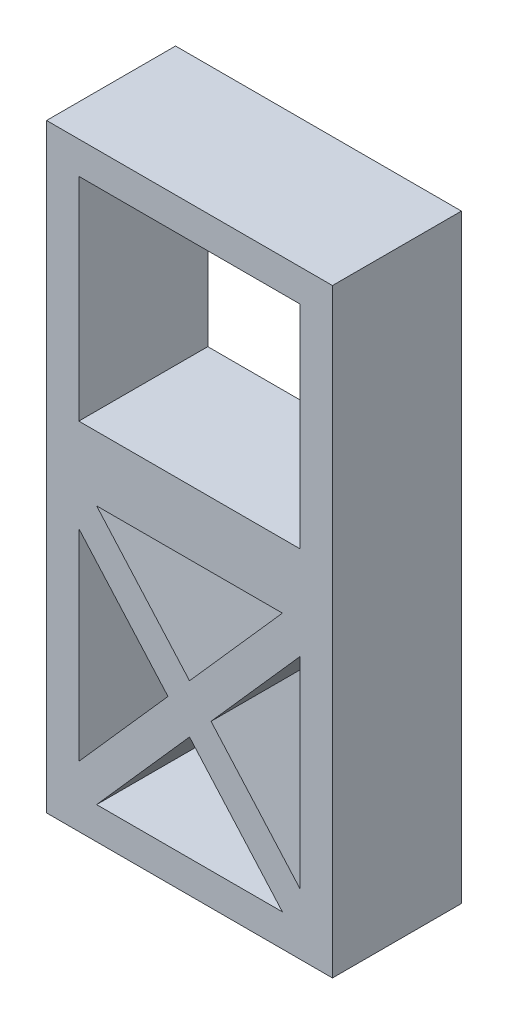
ISO-10303-21;
HEADER;
FILE_DESCRIPTION(('STEP AP214'),'2;1');
FILE_NAME('part.step','',(''),(''),'','','');
FILE_SCHEMA(('AUTOMOTIVE_DESIGN { 1 0 10303 214 1 1 1 1 }'));
ENDSEC;
DATA;
#1=APPLICATION_CONTEXT('core data for automotive mechanical design processes');
#2=APPLICATION_PROTOCOL_DEFINITION('international standard','automotive_design',2000,#1);
#3=PRODUCT_CONTEXT('',#1,'mechanical');
#4=PRODUCT('Part','Part','',(#3));
#5=PRODUCT_RELATED_PRODUCT_CATEGORY('part','',(#4));
#6=PRODUCT_DEFINITION_FORMATION('','',#4);
#7=PRODUCT_DEFINITION_CONTEXT('part definition',#1,'design');
#8=PRODUCT_DEFINITION('design','',#6,#7);
#9=PRODUCT_DEFINITION_SHAPE('','',#8);
#10=(LENGTH_UNIT() NAMED_UNIT(*) SI_UNIT(.MILLI.,.METRE.));
#11=(NAMED_UNIT(*) PLANE_ANGLE_UNIT() SI_UNIT($,.RADIAN.));
#12=(NAMED_UNIT(*) SI_UNIT($,.STERADIAN.) SOLID_ANGLE_UNIT());
#13=UNCERTAINTY_MEASURE_WITH_UNIT(LENGTH_MEASURE(1.E-05),#10,'distance_accuracy_value','');
#14=(GEOMETRIC_REPRESENTATION_CONTEXT(3) GLOBAL_UNCERTAINTY_ASSIGNED_CONTEXT((#13)) GLOBAL_UNIT_ASSIGNED_CONTEXT((#10,
#11,#12)) REPRESENTATION_CONTEXT('',''));
#15=CARTESIAN_POINT('',(0.,0.,0.));
#16=DIRECTION('',(0.,0.,1.));
#17=DIRECTION('',(1.,0.,0.));
#18=AXIS2_PLACEMENT_3D('',#15,#16,#17);
#19=CARTESIAN_POINT('',(0.,0.,25.4));
#20=DIRECTION('',(0.,0.,-1.));
#21=DIRECTION('',(-1.,0.,0.));
#22=AXIS2_PLACEMENT_3D('',#19,#20,#21);
#23=PLANE('',#22);
#24=DIRECTION('',(-0.662535793946931,0.74903025422149,0.));
#25=VECTOR('',#24,1.);
#26=CARTESIAN_POINT('',(0.,-63.8421939246647,25.4));
#27=LINE('',#26,#25);
#28=CARTESIAN_POINT('',(18.2944537397921,-84.524999987,25.4));
#29=VERTEX_POINT('',#28);
#30=CARTESIAN_POINT('',(0.,-63.8421939246647,25.4));
#31=VERTEX_POINT('',#30);
#32=EDGE_CURVE('E197',#29,#31,#27,.T.);
#33=ORIENTED_EDGE('',*,*,#32,.F.);
#34=DIRECTION('',(1.,0.,0.));
#35=VECTOR('',#34,1.);
#36=CARTESIAN_POINT('',(18.2944537397921,-84.524999987,25.4));
#37=LINE('',#36,#35);
#38=CARTESIAN_POINT('',(-18.2944537397921,-84.524999987,25.4));
#39=VERTEX_POINT('',#38);
#40=EDGE_CURVE('E203',#39,#29,#37,.T.);
#41=ORIENTED_EDGE('',*,*,#40,.F.);
#42=DIRECTION('',(-0.662535793946931,-0.74903025422149,0.));
#43=VECTOR('',#42,1.);
#44=CARTESIAN_POINT('',(0.,-63.8421939246647,25.4));
#45=LINE('',#44,#43);
#46=EDGE_CURVE('E199',#31,#39,#45,.T.);
#47=ORIENTED_EDGE('',*,*,#46,.F.);
#48=EDGE_LOOP('',(#33,#41,#47));
#49=FACE_BOUND('',#48,.T.);
#50=DIRECTION('',(0.662535793946931,0.74903025422149,0.));
#51=VECTOR('',#50,1.);
#52=CARTESIAN_POINT('',(18.2944537397921,-33.575000033,25.4));
#53=LINE('',#52,#51);
#54=CARTESIAN_POINT('',(0.,-54.2578060953353,25.4));
#55=VERTEX_POINT('',#54);
#56=CARTESIAN_POINT('',(18.2944537397921,-33.575000033,25.4));
#57=VERTEX_POINT('',#56);
#58=EDGE_CURVE('E245',#55,#57,#53,.T.);
#59=ORIENTED_EDGE('',*,*,#58,.F.);
#60=DIRECTION('',(0.662535793946931,-0.74903025422149,0.));
#61=VECTOR('',#60,1.);
#62=CARTESIAN_POINT('',(-18.2944537397921,-33.575000033,25.4));
#63=LINE('',#62,#61);
#64=CARTESIAN_POINT('',(-18.2944537397921,-33.575000033,25.4));
#65=VERTEX_POINT('',#64);
#66=EDGE_CURVE('E251',#65,#55,#63,.T.);
#67=ORIENTED_EDGE('',*,*,#66,.F.);
#68=DIRECTION('',(-1.,0.,0.));
#69=VECTOR('',#68,1.);
#70=CARTESIAN_POINT('',(-18.2944537397921,-33.575000033,25.4));
#71=LINE('',#70,#69);
#72=EDGE_CURVE('E247',#57,#65,#71,.T.);
#73=ORIENTED_EDGE('',*,*,#72,.F.);
#74=EDGE_LOOP('',(#59,#67,#73));
#75=FACE_BOUND('',#74,.T.);
#76=DIRECTION('',(0.,1.,0.));
#77=VECTOR('',#76,1.);
#78=CARTESIAN_POINT('',(28.149999961,-27.225000033,25.4));
#79=LINE('',#78,#77);
#80=CARTESIAN_POINT('',(28.149999961,-90.874999987,25.4));
#81=VERTEX_POINT('',#80);
#82=CARTESIAN_POINT('',(28.149999961,27.225000033,25.4));
#83=VERTEX_POINT('',#82);
#84=EDGE_CURVE('E300',#81,#83,#79,.T.);
#85=ORIENTED_EDGE('',*,*,#84,.T.);
#86=DIRECTION('',(-1.,0.,0.));
#87=VECTOR('',#86,1.);
#88=CARTESIAN_POINT('',(-28.149999961,27.225000033,25.4));
#89=LINE('',#88,#87);
#90=CARTESIAN_POINT('',(-28.149999961,27.225000033,25.4));
#91=VERTEX_POINT('',#90);
#92=EDGE_CURVE('E303',#83,#91,#89,.T.);
#93=ORIENTED_EDGE('',*,*,#92,.T.);
#94=DIRECTION('',(0.,-1.,0.));
#95=VECTOR('',#94,1.);
#96=CARTESIAN_POINT('',(-28.149999961,-27.225000033,25.4));
#97=LINE('',#96,#95);
#98=CARTESIAN_POINT('',(-28.149999961,-90.874999987,25.4));
#99=VERTEX_POINT('',#98);
#100=EDGE_CURVE('E306',#91,#99,#97,.T.);
#101=ORIENTED_EDGE('',*,*,#100,.T.);
#102=DIRECTION('',(1.,0.,0.));
#103=VECTOR('',#102,1.);
#104=CARTESIAN_POINT('',(-28.149999961,-90.874999987,25.4));
#105=LINE('',#104,#103);
#106=EDGE_CURVE('E308',#99,#81,#105,.T.);
#107=ORIENTED_EDGE('',*,*,#106,.T.);
#108=EDGE_LOOP('',(#85,#93,#101,#107));
#109=FACE_BOUND('',#108,.T.);
#110=DIRECTION('',(0.,1.,0.));
#111=VECTOR('',#110,1.);
#112=CARTESIAN_POINT('',(21.799999961,20.875000033,25.4));
#113=LINE('',#112,#111);
#114=CARTESIAN_POINT('',(21.799999961,-20.875000033,25.4));
#115=VERTEX_POINT('',#114);
#116=CARTESIAN_POINT('',(21.799999961,20.875000033,25.4));
#117=VERTEX_POINT('',#116);
#118=EDGE_CURVE('E269',#115,#117,#113,.T.);
#119=ORIENTED_EDGE('',*,*,#118,.F.);
#120=DIRECTION('',(1.,0.,0.));
#121=VECTOR('',#120,1.);
#122=CARTESIAN_POINT('',(-21.799999961,-20.875000033,25.4));
#123=LINE('',#122,#121);
#124=CARTESIAN_POINT('',(-21.799999961,-20.875000033,25.4));
#125=VERTEX_POINT('',#124);
#126=EDGE_CURVE('E277',#125,#115,#123,.T.);
#127=ORIENTED_EDGE('',*,*,#126,.F.);
#128=DIRECTION('',(0.,-1.,0.));
#129=VECTOR('',#128,1.);
#130=CARTESIAN_POINT('',(-21.799999961,20.875000033,25.4));
#131=LINE('',#130,#129);
#132=CARTESIAN_POINT('',(-21.799999961,20.875000033,25.4));
#133=VERTEX_POINT('',#132);
#134=EDGE_CURVE('E274',#133,#125,#131,.T.);
#135=ORIENTED_EDGE('',*,*,#134,.F.);
#136=DIRECTION('',(-1.,0.,0.));
#137=VECTOR('',#136,1.);
#138=CARTESIAN_POINT('',(-21.799999961,20.875000033,25.4));
#139=LINE('',#138,#137);
#140=EDGE_CURVE('E271',#117,#133,#139,.T.);
#141=ORIENTED_EDGE('',*,*,#140,.F.);
#142=EDGE_LOOP('',(#119,#127,#135,#141));
#143=FACE_BOUND('',#142,.T.);
#144=DIRECTION('',(0.662535793946931,-0.74903025422149,0.));
#145=VECTOR('',#144,1.);
#146=CARTESIAN_POINT('',(4.23881409610081,-59.05000001,25.4));
#147=LINE('',#146,#145);
#148=CARTESIAN_POINT('',(4.23881409610081,-59.05000001,25.4));
#149=VERTEX_POINT('',#148);
#150=CARTESIAN_POINT('',(21.7999999610001,-78.9038096199755,25.4));
#151=VERTEX_POINT('',#150);
#152=EDGE_CURVE('E221',#149,#151,#147,.T.);
#153=ORIENTED_EDGE('',*,*,#152,.F.);
#154=DIRECTION('',(-0.662535793946931,-0.74903025422149,0.));
#155=VECTOR('',#154,1.);
#156=CARTESIAN_POINT('',(21.7999999610001,-39.1961904000245,25.4));
#157=LINE('',#156,#155);
#158=CARTESIAN_POINT('',(21.7999999610001,-39.1961904000245,25.4));
#159=VERTEX_POINT('',#158);
#160=EDGE_CURVE('E227',#159,#149,#157,.T.);
#161=ORIENTED_EDGE('',*,*,#160,.F.);
#162=DIRECTION('',(0.,1.,0.));
#163=VECTOR('',#162,1.);
#164=CARTESIAN_POINT('',(21.7999999610001,-39.1961904000245,25.4));
#165=LINE('',#164,#163);
#166=EDGE_CURVE('E223',#151,#159,#165,.T.);
#167=ORIENTED_EDGE('',*,*,#166,.F.);
#168=EDGE_LOOP('',(#153,#161,#167));
#169=FACE_BOUND('',#168,.T.);
#170=DIRECTION('',(-0.662535793946931,0.74903025422149,0.));
#171=VECTOR('',#170,1.);
#172=CARTESIAN_POINT('',(-21.799999961,-39.1961904000245,25.4));
#173=LINE('',#172,#171);
#174=CARTESIAN_POINT('',(-4.23881409610075,-59.05000001,25.4));
#175=VERTEX_POINT('',#174);
#176=CARTESIAN_POINT('',(-21.799999961,-39.1961904000245,25.4));
#177=VERTEX_POINT('',#176);
#178=EDGE_CURVE('E170',#175,#177,#173,.T.);
#179=ORIENTED_EDGE('',*,*,#178,.F.);
#180=DIRECTION('',(0.662535793946931,0.74903025422149,0.));
#181=VECTOR('',#180,1.);
#182=CARTESIAN_POINT('',(-4.23881409610075,-59.05000001,25.4));
#183=LINE('',#182,#181);
#184=CARTESIAN_POINT('',(-21.799999961,-78.9038096199755,25.4));
#185=VERTEX_POINT('',#184);
#186=EDGE_CURVE('E187',#185,#175,#183,.T.);
#187=ORIENTED_EDGE('',*,*,#186,.F.);
#188=DIRECTION('',(0.,-1.,0.));
#189=VECTOR('',#188,1.);
#190=CARTESIAN_POINT('',(-21.799999961,-78.9038096199755,25.4));
#191=LINE('',#190,#189);
#192=EDGE_CURVE('E178',#177,#185,#191,.T.);
#193=ORIENTED_EDGE('',*,*,#192,.F.);
#194=EDGE_LOOP('',(#179,#187,#193));
#195=FACE_BOUND('',#194,.T.);
#196=ADVANCED_FACE('F33',(#49,#75,#109,#143,#169,#195),#23,.F.);
#197=CARTESIAN_POINT('',(0.,0.,0.));
#198=DIRECTION('',(0.,0.,-1.));
#199=DIRECTION('',(-1.,0.,0.));
#200=AXIS2_PLACEMENT_3D('',#197,#198,#199);
#201=PLANE('',#200);
#202=DIRECTION('',(-1.,0.,0.));
#203=VECTOR('',#202,1.);
#204=CARTESIAN_POINT('',(-28.149999961,27.225000033,0.));
#205=LINE('',#204,#203);
#206=CARTESIAN_POINT('',(28.149999961,27.225000033,0.));
#207=VERTEX_POINT('',#206);
#208=CARTESIAN_POINT('',(-28.149999961,27.225000033,0.));
#209=VERTEX_POINT('',#208);
#210=EDGE_CURVE('E299',#207,#209,#205,.T.);
#211=ORIENTED_EDGE('',*,*,#210,.F.);
#212=DIRECTION('',(0.,1.,0.));
#213=VECTOR('',#212,1.);
#214=CARTESIAN_POINT('',(28.149999961,-27.225000033,0.));
#215=LINE('',#214,#213);
#216=CARTESIAN_POINT('',(28.149999961,-90.874999987,0.));
#217=VERTEX_POINT('',#216);
#218=EDGE_CURVE('E304',#217,#207,#215,.T.);
#219=ORIENTED_EDGE('',*,*,#218,.F.);
#220=DIRECTION('',(1.,0.,0.));
#221=VECTOR('',#220,1.);
#222=CARTESIAN_POINT('',(-28.149999961,-90.874999987,0.));
#223=LINE('',#222,#221);
#224=CARTESIAN_POINT('',(-28.149999961,-90.874999987,0.));
#225=VERTEX_POINT('',#224);
#226=EDGE_CURVE('E316',#225,#217,#223,.T.);
#227=ORIENTED_EDGE('',*,*,#226,.F.);
#228=DIRECTION('',(0.,-1.,0.));
#229=VECTOR('',#228,1.);
#230=CARTESIAN_POINT('',(-28.149999961,-27.225000033,0.));
#231=LINE('',#230,#229);
#232=EDGE_CURVE('E314',#209,#225,#231,.T.);
#233=ORIENTED_EDGE('',*,*,#232,.F.);
#234=EDGE_LOOP('',(#211,#219,#227,#233));
#235=FACE_BOUND('',#234,.T.);
#236=DIRECTION('',(1.,0.,0.));
#237=VECTOR('',#236,1.);
#238=CARTESIAN_POINT('',(-21.799999961,-20.875000033,0.));
#239=LINE('',#238,#237);
#240=CARTESIAN_POINT('',(-21.799999961,-20.875000033,0.));
#241=VERTEX_POINT('',#240);
#242=CARTESIAN_POINT('',(21.799999961,-20.875000033,0.));
#243=VERTEX_POINT('',#242);
#244=EDGE_CURVE('E272',#241,#243,#239,.T.);
#245=ORIENTED_EDGE('',*,*,#244,.T.);
#246=DIRECTION('',(0.,1.,0.));
#247=VECTOR('',#246,1.);
#248=CARTESIAN_POINT('',(21.799999961,20.875000033,0.));
#249=LINE('',#248,#247);
#250=CARTESIAN_POINT('',(21.799999961,20.875000033,0.));
#251=VERTEX_POINT('',#250);
#252=EDGE_CURVE('E268',#243,#251,#249,.T.);
#253=ORIENTED_EDGE('',*,*,#252,.T.);
#254=DIRECTION('',(-1.,0.,0.));
#255=VECTOR('',#254,1.);
#256=CARTESIAN_POINT('',(-21.799999961,20.875000033,0.));
#257=LINE('',#256,#255);
#258=CARTESIAN_POINT('',(-21.799999961,20.875000033,0.));
#259=VERTEX_POINT('',#258);
#260=EDGE_CURVE('E282',#251,#259,#257,.T.);
#261=ORIENTED_EDGE('',*,*,#260,.T.);
#262=DIRECTION('',(0.,-1.,0.));
#263=VECTOR('',#262,1.);
#264=CARTESIAN_POINT('',(-21.799999961,20.875000033,0.));
#265=LINE('',#264,#263);
#266=EDGE_CURVE('E285',#259,#241,#265,.T.);
#267=ORIENTED_EDGE('',*,*,#266,.T.);
#268=EDGE_LOOP('',(#245,#253,#261,#267));
#269=FACE_BOUND('',#268,.T.);
#270=DIRECTION('',(0.662535793946931,-0.74903025422149,0.));
#271=VECTOR('',#270,1.);
#272=CARTESIAN_POINT('',(-18.2944537397921,-33.575000033,0.));
#273=LINE('',#272,#271);
#274=CARTESIAN_POINT('',(-18.2944537397921,-33.575000033,0.));
#275=VERTEX_POINT('',#274);
#276=CARTESIAN_POINT('',(0.,-54.2578060953353,0.));
#277=VERTEX_POINT('',#276);
#278=EDGE_CURVE('E248',#275,#277,#273,.T.);
#279=ORIENTED_EDGE('',*,*,#278,.T.);
#280=DIRECTION('',(0.662535793946931,0.74903025422149,0.));
#281=VECTOR('',#280,1.);
#282=CARTESIAN_POINT('',(18.2944537397921,-33.575000033,0.));
#283=LINE('',#282,#281);
#284=CARTESIAN_POINT('',(18.2944537397921,-33.575000033,0.));
#285=VERTEX_POINT('',#284);
#286=EDGE_CURVE('E244',#277,#285,#283,.T.);
#287=ORIENTED_EDGE('',*,*,#286,.T.);
#288=DIRECTION('',(-1.,0.,0.));
#289=VECTOR('',#288,1.);
#290=CARTESIAN_POINT('',(-18.2944537397921,-33.575000033,0.));
#291=LINE('',#290,#289);
#292=EDGE_CURVE('E256',#285,#275,#291,.T.);
#293=ORIENTED_EDGE('',*,*,#292,.T.);
#294=EDGE_LOOP('',(#279,#287,#293));
#295=FACE_BOUND('',#294,.T.);
#296=DIRECTION('',(-0.662535793946931,-0.74903025422149,0.));
#297=VECTOR('',#296,1.);
#298=CARTESIAN_POINT('',(21.7999999610001,-39.1961904000245,0.));
#299=LINE('',#298,#297);
#300=CARTESIAN_POINT('',(21.7999999610001,-39.1961904000245,0.));
#301=VERTEX_POINT('',#300);
#302=CARTESIAN_POINT('',(4.2388140961008,-59.05000001,0.));
#303=VERTEX_POINT('',#302);
#304=EDGE_CURVE('E224',#301,#303,#299,.T.);
#305=ORIENTED_EDGE('',*,*,#304,.T.);
#306=DIRECTION('',(0.662535793946931,-0.74903025422149,0.));
#307=VECTOR('',#306,1.);
#308=CARTESIAN_POINT('',(4.23881409610081,-59.05000001,0.));
#309=LINE('',#308,#307);
#310=CARTESIAN_POINT('',(21.7999999610001,-78.9038096199755,0.));
#311=VERTEX_POINT('',#310);
#312=EDGE_CURVE('E220',#303,#311,#309,.T.);
#313=ORIENTED_EDGE('',*,*,#312,.T.);
#314=DIRECTION('',(0.,1.,0.));
#315=VECTOR('',#314,1.);
#316=CARTESIAN_POINT('',(21.7999999610001,-39.1961904000245,0.));
#317=LINE('',#316,#315);
#318=EDGE_CURVE('E232',#311,#301,#317,.T.);
#319=ORIENTED_EDGE('',*,*,#318,.T.);
#320=EDGE_LOOP('',(#305,#313,#319));
#321=FACE_BOUND('',#320,.T.);
#322=DIRECTION('',(1.,0.,0.));
#323=VECTOR('',#322,1.);
#324=CARTESIAN_POINT('',(18.2944537397921,-84.524999987,0.));
#325=LINE('',#324,#323);
#326=CARTESIAN_POINT('',(-18.2944537397921,-84.524999987,0.));
#327=VERTEX_POINT('',#326);
#328=CARTESIAN_POINT('',(18.2944537397921,-84.524999987,0.));
#329=VERTEX_POINT('',#328);
#330=EDGE_CURVE('E200',#327,#329,#325,.T.);
#331=ORIENTED_EDGE('',*,*,#330,.T.);
#332=DIRECTION('',(-0.662535793946931,0.74903025422149,0.));
#333=VECTOR('',#332,1.);
#334=CARTESIAN_POINT('',(0.,-63.8421939246647,0.));
#335=LINE('',#334,#333);
#336=CARTESIAN_POINT('',(0.,-63.8421939246647,0.));
#337=VERTEX_POINT('',#336);
#338=EDGE_CURVE('E185',#329,#337,#335,.T.);
#339=ORIENTED_EDGE('',*,*,#338,.T.);
#340=DIRECTION('',(-0.662535793946931,-0.74903025422149,0.));
#341=VECTOR('',#340,1.);
#342=CARTESIAN_POINT('',(0.,-63.8421939246647,0.));
#343=LINE('',#342,#341);
#344=EDGE_CURVE('E208',#337,#327,#343,.T.);
#345=ORIENTED_EDGE('',*,*,#344,.T.);
#346=EDGE_LOOP('',(#331,#339,#345));
#347=FACE_BOUND('',#346,.T.);
#348=DIRECTION('',(0.662535793946931,0.74903025422149,0.));
#349=VECTOR('',#348,1.);
#350=CARTESIAN_POINT('',(-4.23881409610075,-59.05000001,0.));
#351=LINE('',#350,#349);
#352=CARTESIAN_POINT('',(-21.799999961,-78.9038096199755,0.));
#353=VERTEX_POINT('',#352);
#354=CARTESIAN_POINT('',(-4.23881409610074,-59.05000001,0.));
#355=VERTEX_POINT('',#354);
#356=EDGE_CURVE('E179',#353,#355,#351,.T.);
#357=ORIENTED_EDGE('',*,*,#356,.T.);
#358=DIRECTION('',(-0.662535793946931,0.74903025422149,0.));
#359=VECTOR('',#358,1.);
#360=CARTESIAN_POINT('',(-21.799999961,-39.1961904000245,0.));
#361=LINE('',#360,#359);
#362=CARTESIAN_POINT('',(-21.799999961,-39.1961904000245,0.));
#363=VERTEX_POINT('',#362);
#364=EDGE_CURVE('E56',#355,#363,#361,.T.);
#365=ORIENTED_EDGE('',*,*,#364,.T.);
#366=DIRECTION('',(0.,-1.,0.));
#367=VECTOR('',#366,1.);
#368=CARTESIAN_POINT('',(-21.799999961,-78.9038096199755,0.));
#369=LINE('',#368,#367);
#370=EDGE_CURVE('E184',#363,#353,#369,.T.);
#371=ORIENTED_EDGE('',*,*,#370,.T.);
#372=EDGE_LOOP('',(#357,#365,#371));
#373=FACE_BOUND('',#372,.T.);
#374=ADVANCED_FACE('F334',(#235,#269,#295,#321,#347,#373),#201,.T.);
#375=CARTESIAN_POINT('',(-28.149999961,27.225000033,25.4));
#376=DIRECTION('',(0.,-1.,0.));
#377=DIRECTION('',(0.,0.,-1.));
#378=AXIS2_PLACEMENT_3D('',#375,#376,#377);
#379=PLANE('',#378);
#380=ORIENTED_EDGE('',*,*,#210,.T.);
#381=DIRECTION('',(0.,0.,-1.));
#382=VECTOR('',#381,1.);
#383=CARTESIAN_POINT('',(-28.149999961,27.225000033,25.4));
#384=LINE('',#383,#382);
#385=EDGE_CURVE('E41',#91,#209,#384,.T.);
#386=ORIENTED_EDGE('',*,*,#385,.F.);
#387=ORIENTED_EDGE('',*,*,#92,.F.);
#388=DIRECTION('',(0.,0.,-1.));
#389=VECTOR('',#388,1.);
#390=CARTESIAN_POINT('',(28.149999961,27.225000033,25.4));
#391=LINE('',#390,#389);
#392=EDGE_CURVE('E11',#83,#207,#391,.T.);
#393=ORIENTED_EDGE('',*,*,#392,.T.);
#394=EDGE_LOOP('',(#380,#386,#387,#393));
#395=FACE_BOUND('',#394,.T.);
#396=ADVANCED_FACE('F35',(#395),#379,.F.);
#397=CARTESIAN_POINT('',(-28.149999961,-27.225000033,25.4));
#398=DIRECTION('',(1.,0.,0.));
#399=DIRECTION('',(0.,1.,0.));
#400=AXIS2_PLACEMENT_3D('',#397,#398,#399);
#401=PLANE('',#400);
#402=ORIENTED_EDGE('',*,*,#232,.T.);
#403=DIRECTION('',(0.,0.,-1.));
#404=VECTOR('',#403,1.);
#405=CARTESIAN_POINT('',(-28.149999961,-90.874999987,25.4));
#406=LINE('',#405,#404);
#407=EDGE_CURVE('E321',#99,#225,#406,.T.);
#408=ORIENTED_EDGE('',*,*,#407,.F.);
#409=ORIENTED_EDGE('',*,*,#100,.F.);
#410=ORIENTED_EDGE('',*,*,#385,.T.);
#411=EDGE_LOOP('',(#402,#408,#409,#410));
#412=FACE_BOUND('',#411,.T.);
#413=ADVANCED_FACE('F327',(#412),#401,.F.);
#414=CARTESIAN_POINT('',(-28.149999961,-90.874999987,25.4));
#415=DIRECTION('',(0.,1.,0.));
#416=DIRECTION('',(0.,0.,1.));
#417=AXIS2_PLACEMENT_3D('',#414,#415,#416);
#418=PLANE('',#417);
#419=ORIENTED_EDGE('',*,*,#226,.T.);
#420=DIRECTION('',(0.,0.,-1.));
#421=VECTOR('',#420,1.);
#422=CARTESIAN_POINT('',(28.149999961,-90.874999987,25.4));
#423=LINE('',#422,#421);
#424=EDGE_CURVE('E311',#81,#217,#423,.T.);
#425=ORIENTED_EDGE('',*,*,#424,.F.);
#426=ORIENTED_EDGE('',*,*,#106,.F.);
#427=ORIENTED_EDGE('',*,*,#407,.T.);
#428=EDGE_LOOP('',(#419,#425,#426,#427));
#429=FACE_BOUND('',#428,.T.);
#430=ADVANCED_FACE('F339',(#429),#418,.F.);
#431=CARTESIAN_POINT('',(28.149999961,-27.225000033,25.4));
#432=DIRECTION('',(-1.,0.,0.));
#433=DIRECTION('',(0.,-1.,0.));
#434=AXIS2_PLACEMENT_3D('',#431,#432,#433);
#435=PLANE('',#434);
#436=ORIENTED_EDGE('',*,*,#218,.T.);
#437=ORIENTED_EDGE('',*,*,#392,.F.);
#438=ORIENTED_EDGE('',*,*,#84,.F.);
#439=ORIENTED_EDGE('',*,*,#424,.T.);
#440=EDGE_LOOP('',(#436,#437,#438,#439));
#441=FACE_BOUND('',#440,.T.);
#442=ADVANCED_FACE('F342',(#441),#435,.F.);
#443=CARTESIAN_POINT('',(21.799999961,20.875000033,25.4));
#444=DIRECTION('',(-1.,0.,0.));
#445=DIRECTION('',(0.,-1.,0.));
#446=AXIS2_PLACEMENT_3D('',#443,#444,#445);
#447=PLANE('',#446);
#448=ORIENTED_EDGE('',*,*,#252,.F.);
#449=DIRECTION('',(0.,0.,-1.));
#450=VECTOR('',#449,1.);
#451=CARTESIAN_POINT('',(21.799999961,-20.875000033,25.4));
#452=LINE('',#451,#450);
#453=EDGE_CURVE('E279',#115,#243,#452,.T.);
#454=ORIENTED_EDGE('',*,*,#453,.F.);
#455=ORIENTED_EDGE('',*,*,#118,.T.);
#456=DIRECTION('',(0.,0.,-1.));
#457=VECTOR('',#456,1.);
#458=CARTESIAN_POINT('',(21.799999961,20.875000033,25.4));
#459=LINE('',#458,#457);
#460=EDGE_CURVE('E296',#117,#251,#459,.T.);
#461=ORIENTED_EDGE('',*,*,#460,.T.);
#462=EDGE_LOOP('',(#448,#454,#455,#461));
#463=FACE_BOUND('',#462,.T.);
#464=ADVANCED_FACE('F404',(#463),#447,.T.);
#465=CARTESIAN_POINT('',(-21.799999961,20.875000033,25.4));
#466=DIRECTION('',(0.,-1.,0.));
#467=DIRECTION('',(0.,0.,-1.));
#468=AXIS2_PLACEMENT_3D('',#465,#466,#467);
#469=PLANE('',#468);
#470=ORIENTED_EDGE('',*,*,#260,.F.);
#471=ORIENTED_EDGE('',*,*,#460,.F.);
#472=ORIENTED_EDGE('',*,*,#140,.T.);
#473=DIRECTION('',(0.,0.,-1.));
#474=VECTOR('',#473,1.);
#475=CARTESIAN_POINT('',(-21.799999961,20.875000033,25.4));
#476=LINE('',#475,#474);
#477=EDGE_CURVE('E294',#133,#259,#476,.T.);
#478=ORIENTED_EDGE('',*,*,#477,.T.);
#479=EDGE_LOOP('',(#470,#471,#472,#478));
#480=FACE_BOUND('',#479,.T.);
#481=ADVANCED_FACE('F400',(#480),#469,.T.);
#482=CARTESIAN_POINT('',(-21.799999961,20.875000033,25.4));
#483=DIRECTION('',(1.,0.,0.));
#484=DIRECTION('',(0.,1.,0.));
#485=AXIS2_PLACEMENT_3D('',#482,#483,#484);
#486=PLANE('',#485);
#487=ORIENTED_EDGE('',*,*,#266,.F.);
#488=ORIENTED_EDGE('',*,*,#477,.F.);
#489=ORIENTED_EDGE('',*,*,#134,.T.);
#490=DIRECTION('',(0.,0.,-1.));
#491=VECTOR('',#490,1.);
#492=CARTESIAN_POINT('',(-21.799999961,-20.875000033,25.4));
#493=LINE('',#492,#491);
#494=EDGE_CURVE('E292',#125,#241,#493,.T.);
#495=ORIENTED_EDGE('',*,*,#494,.T.);
#496=EDGE_LOOP('',(#487,#488,#489,#495));
#497=FACE_BOUND('',#496,.T.);
#498=ADVANCED_FACE('F396',(#497),#486,.T.);
#499=CARTESIAN_POINT('',(-21.799999961,-20.875000033,25.4));
#500=DIRECTION('',(0.,1.,0.));
#501=DIRECTION('',(0.,0.,1.));
#502=AXIS2_PLACEMENT_3D('',#499,#500,#501);
#503=PLANE('',#502);
#504=ORIENTED_EDGE('',*,*,#244,.F.);
#505=ORIENTED_EDGE('',*,*,#494,.F.);
#506=ORIENTED_EDGE('',*,*,#126,.T.);
#507=ORIENTED_EDGE('',*,*,#453,.T.);
#508=EDGE_LOOP('',(#504,#505,#506,#507));
#509=FACE_BOUND('',#508,.T.);
#510=ADVANCED_FACE('F392',(#509),#503,.T.);
#511=CARTESIAN_POINT('',(18.2944537397921,-33.575000033,25.4));
#512=DIRECTION('',(-0.74903025422149,0.662535793946931,0.));
#513=DIRECTION('',(-0.662535793946931,-0.74903025422149,0.));
#514=AXIS2_PLACEMENT_3D('',#511,#512,#513);
#515=PLANE('',#514);
#516=ORIENTED_EDGE('',*,*,#286,.F.);
#517=DIRECTION('',(0.,0.,-1.));
#518=VECTOR('',#517,1.);
#519=CARTESIAN_POINT('',(0.,-54.2578060953353,25.4));
#520=LINE('',#519,#518);
#521=EDGE_CURVE('E253',#55,#277,#520,.T.);
#522=ORIENTED_EDGE('',*,*,#521,.F.);
#523=ORIENTED_EDGE('',*,*,#58,.T.);
#524=DIRECTION('',(0.,0.,-1.));
#525=VECTOR('',#524,1.);
#526=CARTESIAN_POINT('',(18.2944537397921,-33.575000033,25.4));
#527=LINE('',#526,#525);
#528=EDGE_CURVE('E265',#57,#285,#527,.T.);
#529=ORIENTED_EDGE('',*,*,#528,.T.);
#530=EDGE_LOOP('',(#516,#522,#523,#529));
#531=FACE_BOUND('',#530,.T.);
#532=ADVANCED_FACE('F388',(#531),#515,.T.);
#533=CARTESIAN_POINT('',(-18.2944537397921,-33.575000033,25.4));
#534=DIRECTION('',(0.,-1.,0.));
#535=DIRECTION('',(1.,0.,0.));
#536=AXIS2_PLACEMENT_3D('',#533,#534,#535);
#537=PLANE('',#536);
#538=ORIENTED_EDGE('',*,*,#292,.F.);
#539=ORIENTED_EDGE('',*,*,#528,.F.);
#540=ORIENTED_EDGE('',*,*,#72,.T.);
#541=DIRECTION('',(0.,0.,-1.));
#542=VECTOR('',#541,1.);
#543=CARTESIAN_POINT('',(-18.2944537397921,-33.575000033,25.4));
#544=LINE('',#543,#542);
#545=EDGE_CURVE('E263',#65,#275,#544,.T.);
#546=ORIENTED_EDGE('',*,*,#545,.T.);
#547=EDGE_LOOP('',(#538,#539,#540,#546));
#548=FACE_BOUND('',#547,.T.);
#549=ADVANCED_FACE('F384',(#548),#537,.T.);
#550=CARTESIAN_POINT('',(-18.2944537397921,-33.575000033,25.4));
#551=DIRECTION('',(0.74903025422149,0.662535793946931,0.));
#552=DIRECTION('',(-0.662535793946931,0.74903025422149,0.));
#553=AXIS2_PLACEMENT_3D('',#550,#551,#552);
#554=PLANE('',#553);
#555=ORIENTED_EDGE('',*,*,#278,.F.);
#556=ORIENTED_EDGE('',*,*,#545,.F.);
#557=ORIENTED_EDGE('',*,*,#66,.T.);
#558=ORIENTED_EDGE('',*,*,#521,.T.);
#559=EDGE_LOOP('',(#555,#556,#557,#558));
#560=FACE_BOUND('',#559,.T.);
#561=ADVANCED_FACE('F381',(#560),#554,.T.);
#562=CARTESIAN_POINT('',(4.23881409610081,-59.05000001,25.4));
#563=DIRECTION('',(0.74903025422149,0.662535793946931,0.));
#564=DIRECTION('',(-0.662535793946931,0.74903025422149,0.));
#565=AXIS2_PLACEMENT_3D('',#562,#563,#564);
#566=PLANE('',#565);
#567=ORIENTED_EDGE('',*,*,#312,.F.);
#568=DIRECTION('',(0.,0.,-1.));
#569=VECTOR('',#568,1.);
#570=CARTESIAN_POINT('',(4.23881409610081,-59.05000001,25.4));
#571=LINE('',#570,#569);
#572=EDGE_CURVE('E229',#149,#303,#571,.T.);
#573=ORIENTED_EDGE('',*,*,#572,.F.);
#574=ORIENTED_EDGE('',*,*,#152,.T.);
#575=DIRECTION('',(0.,0.,-1.));
#576=VECTOR('',#575,1.);
#577=CARTESIAN_POINT('',(21.7999999610001,-78.9038096199755,25.4));
#578=LINE('',#577,#576);
#579=EDGE_CURVE('E241',#151,#311,#578,.T.);
#580=ORIENTED_EDGE('',*,*,#579,.T.);
#581=EDGE_LOOP('',(#567,#573,#574,#580));
#582=FACE_BOUND('',#581,.T.);
#583=ADVANCED_FACE('F358',(#582),#566,.T.);
#584=CARTESIAN_POINT('',(21.7999999610001,-39.1961904000245,25.4));
#585=DIRECTION('',(-1.,0.,0.));
#586=DIRECTION('',(0.,0.,1.));
#587=AXIS2_PLACEMENT_3D('',#584,#585,#586);
#588=PLANE('',#587);
#589=ORIENTED_EDGE('',*,*,#318,.F.);
#590=ORIENTED_EDGE('',*,*,#579,.F.);
#591=ORIENTED_EDGE('',*,*,#166,.T.);
#592=DIRECTION('',(0.,0.,-1.));
#593=VECTOR('',#592,1.);
#594=CARTESIAN_POINT('',(21.7999999610001,-39.1961904000245,25.4));
#595=LINE('',#594,#593);
#596=EDGE_CURVE('E239',#159,#301,#595,.T.);
#597=ORIENTED_EDGE('',*,*,#596,.T.);
#598=EDGE_LOOP('',(#589,#590,#591,#597));
#599=FACE_BOUND('',#598,.T.);
#600=ADVANCED_FACE('F360',(#599),#588,.T.);
#601=CARTESIAN_POINT('',(21.7999999610001,-39.1961904000245,25.4));
#602=DIRECTION('',(0.74903025422149,-0.662535793946931,0.));
#603=DIRECTION('',(0.662535793946931,0.74903025422149,0.));
#604=AXIS2_PLACEMENT_3D('',#601,#602,#603);
#605=PLANE('',#604);
#606=ORIENTED_EDGE('',*,*,#304,.F.);
#607=ORIENTED_EDGE('',*,*,#596,.F.);
#608=ORIENTED_EDGE('',*,*,#160,.T.);
#609=ORIENTED_EDGE('',*,*,#572,.T.);
#610=EDGE_LOOP('',(#606,#607,#608,#609));
#611=FACE_BOUND('',#610,.T.);
#612=ADVANCED_FACE('F365',(#611),#605,.T.);
#613=CARTESIAN_POINT('',(0.,-63.8421939246647,25.4));
#614=DIRECTION('',(-0.74903025422149,-0.662535793946931,0.));
#615=DIRECTION('',(0.662535793946931,-0.74903025422149,0.));
#616=AXIS2_PLACEMENT_3D('',#613,#614,#615);
#617=PLANE('',#616);
#618=ORIENTED_EDGE('',*,*,#338,.F.);
#619=DIRECTION('',(0.,0.,-1.));
#620=VECTOR('',#619,1.);
#621=CARTESIAN_POINT('',(18.2944537397921,-84.524999987,25.4));
#622=LINE('',#621,#620);
#623=EDGE_CURVE('E205',#29,#329,#622,.T.);
#624=ORIENTED_EDGE('',*,*,#623,.F.);
#625=ORIENTED_EDGE('',*,*,#32,.T.);
#626=DIRECTION('',(0.,0.,-1.));
#627=VECTOR('',#626,1.);
#628=CARTESIAN_POINT('',(0.,-63.8421939246647,25.4));
#629=LINE('',#628,#627);
#630=EDGE_CURVE('E217',#31,#337,#629,.T.);
#631=ORIENTED_EDGE('',*,*,#630,.T.);
#632=EDGE_LOOP('',(#618,#624,#625,#631));
#633=FACE_BOUND('',#632,.T.);
#634=ADVANCED_FACE('F367',(#633),#617,.T.);
#635=CARTESIAN_POINT('',(0.,-63.8421939246647,25.4));
#636=DIRECTION('',(0.74903025422149,-0.662535793946931,0.));
#637=DIRECTION('',(0.662535793946931,0.74903025422149,0.));
#638=AXIS2_PLACEMENT_3D('',#635,#636,#637);
#639=PLANE('',#638);
#640=ORIENTED_EDGE('',*,*,#344,.F.);
#641=ORIENTED_EDGE('',*,*,#630,.F.);
#642=ORIENTED_EDGE('',*,*,#46,.T.);
#643=DIRECTION('',(0.,0.,-1.));
#644=VECTOR('',#643,1.);
#645=CARTESIAN_POINT('',(-18.2944537397921,-84.524999987,25.4));
#646=LINE('',#645,#644);
#647=EDGE_CURVE('E215',#39,#327,#646,.T.);
#648=ORIENTED_EDGE('',*,*,#647,.T.);
#649=EDGE_LOOP('',(#640,#641,#642,#648));
#650=FACE_BOUND('',#649,.T.);
#651=ADVANCED_FACE('F373',(#650),#639,.T.);
#652=CARTESIAN_POINT('',(18.2944537397921,-84.524999987,25.4));
#653=DIRECTION('',(0.,1.,0.));
#654=DIRECTION('',(-1.,0.,0.));
#655=AXIS2_PLACEMENT_3D('',#652,#653,#654);
#656=PLANE('',#655);
#657=ORIENTED_EDGE('',*,*,#330,.F.);
#658=ORIENTED_EDGE('',*,*,#647,.F.);
#659=ORIENTED_EDGE('',*,*,#40,.T.);
#660=ORIENTED_EDGE('',*,*,#623,.T.);
#661=EDGE_LOOP('',(#657,#658,#659,#660));
#662=FACE_BOUND('',#661,.T.);
#663=ADVANCED_FACE('F516',(#662),#656,.T.);
#664=CARTESIAN_POINT('',(-21.799999961,-39.1961904000245,25.4));
#665=DIRECTION('',(-0.74903025422149,-0.662535793946931,0.));
#666=DIRECTION('',(0.662535793946931,-0.74903025422149,0.));
#667=AXIS2_PLACEMENT_3D('',#664,#665,#666);
#668=PLANE('',#667);
#669=ORIENTED_EDGE('',*,*,#364,.F.);
#670=DIRECTION('',(0.,0.,-1.));
#671=VECTOR('',#670,1.);
#672=CARTESIAN_POINT('',(-4.23881409610075,-59.05000001,25.4));
#673=LINE('',#672,#671);
#674=EDGE_CURVE('E174',#175,#355,#673,.T.);
#675=ORIENTED_EDGE('',*,*,#674,.F.);
#676=ORIENTED_EDGE('',*,*,#178,.T.);
#677=DIRECTION('',(0.,0.,-1.));
#678=VECTOR('',#677,1.);
#679=CARTESIAN_POINT('',(-21.799999961,-39.1961904000245,25.4));
#680=LINE('',#679,#678);
#681=EDGE_CURVE('E173',#177,#363,#680,.T.);
#682=ORIENTED_EDGE('',*,*,#681,.T.);
#683=EDGE_LOOP('',(#669,#675,#676,#682));
#684=FACE_BOUND('',#683,.T.);
#685=ADVANCED_FACE('F172',(#684),#668,.T.);
#686=CARTESIAN_POINT('',(-21.799999961,-78.9038096199755,25.4));
#687=DIRECTION('',(1.,0.,0.));
#688=DIRECTION('',(0.,0.,-1.));
#689=AXIS2_PLACEMENT_3D('',#686,#687,#688);
#690=PLANE('',#689);
#691=ORIENTED_EDGE('',*,*,#370,.F.);
#692=ORIENTED_EDGE('',*,*,#681,.F.);
#693=ORIENTED_EDGE('',*,*,#192,.T.);
#694=DIRECTION('',(0.,0.,-1.));
#695=VECTOR('',#694,1.);
#696=CARTESIAN_POINT('',(-21.799999961,-78.9038096199755,25.4));
#697=LINE('',#696,#695);
#698=EDGE_CURVE('E48',#185,#353,#697,.T.);
#699=ORIENTED_EDGE('',*,*,#698,.T.);
#700=EDGE_LOOP('',(#691,#692,#693,#699));
#701=FACE_BOUND('',#700,.T.);
#702=ADVANCED_FACE('F182',(#701),#690,.T.);
#703=CARTESIAN_POINT('',(-4.23881409610075,-59.05000001,25.4));
#704=DIRECTION('',(-0.74903025422149,0.662535793946931,0.));
#705=DIRECTION('',(-0.662535793946931,-0.74903025422149,0.));
#706=AXIS2_PLACEMENT_3D('',#703,#704,#705);
#707=PLANE('',#706);
#708=ORIENTED_EDGE('',*,*,#356,.F.);
#709=ORIENTED_EDGE('',*,*,#698,.F.);
#710=ORIENTED_EDGE('',*,*,#186,.T.);
#711=ORIENTED_EDGE('',*,*,#674,.T.);
#712=EDGE_LOOP('',(#708,#709,#710,#711));
#713=FACE_BOUND('',#712,.T.);
#714=ADVANCED_FACE('F539',(#713),#707,.T.);
#715=CLOSED_SHELL('',(#196,#374,#396,#413,#430,#442,#464,#481,#498,#510,#532,#549,#561,#583,
#600,#612,#634,#651,#663,#685,#702,#714));
#716=MANIFOLD_SOLID_BREP('B2',#715);
#717=ADVANCED_BREP_SHAPE_REPRESENTATION('',(#18,#716),#14);
#718=SHAPE_DEFINITION_REPRESENTATION(#9,#717);
ENDSEC;
END-ISO-10303-21;
